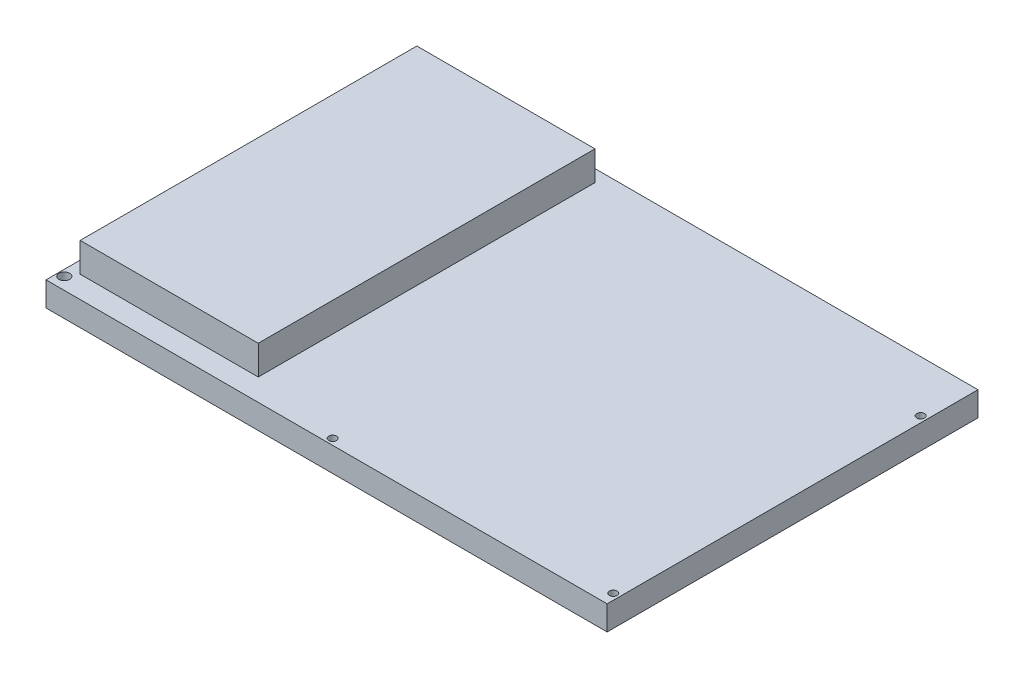
ISO-10303-21;
HEADER;
FILE_DESCRIPTION(('STEP AP214'),'2;1');
FILE_NAME('part.step','',(''),(''),'','','');
FILE_SCHEMA(('AUTOMOTIVE_DESIGN { 1 0 10303 214 1 1 1 1 }'));
ENDSEC;
DATA;
#1=APPLICATION_CONTEXT('core data for automotive mechanical design processes');
#2=APPLICATION_PROTOCOL_DEFINITION('international standard','automotive_design',2000,#1);
#3=PRODUCT_CONTEXT('',#1,'mechanical');
#4=PRODUCT('Part','Part','',(#3));
#5=PRODUCT_RELATED_PRODUCT_CATEGORY('part','',(#4));
#6=PRODUCT_DEFINITION_FORMATION('','',#4);
#7=PRODUCT_DEFINITION_CONTEXT('part definition',#1,'design');
#8=PRODUCT_DEFINITION('design','',#6,#7);
#9=PRODUCT_DEFINITION_SHAPE('','',#8);
#10=(LENGTH_UNIT() NAMED_UNIT(*) SI_UNIT(.MILLI.,.METRE.));
#11=(NAMED_UNIT(*) PLANE_ANGLE_UNIT() SI_UNIT($,.RADIAN.));
#12=(NAMED_UNIT(*) SI_UNIT($,.STERADIAN.) SOLID_ANGLE_UNIT());
#13=UNCERTAINTY_MEASURE_WITH_UNIT(LENGTH_MEASURE(1.E-05),#10,'distance_accuracy_value','');
#14=(GEOMETRIC_REPRESENTATION_CONTEXT(3) GLOBAL_UNCERTAINTY_ASSIGNED_CONTEXT((#13)) GLOBAL_UNIT_ASSIGNED_CONTEXT((#10,
#11,#12)) REPRESENTATION_CONTEXT('',''));
#15=CARTESIAN_POINT('',(0.,0.,0.));
#16=DIRECTION('',(0.,0.,1.));
#17=DIRECTION('',(1.,0.,0.));
#18=AXIS2_PLACEMENT_3D('',#15,#16,#17);
#19=CARTESIAN_POINT('',(0.,10.,0.));
#20=DIRECTION('',(0.,1.,0.));
#21=DIRECTION('',(0.,0.,1.));
#22=AXIS2_PLACEMENT_3D('',#19,#20,#21);
#23=PLANE('',#22);
#24=CARTESIAN_POINT('',(-112.500000000001,10.,70.9999999999998));
#25=DIRECTION('',(0.,1.,0.));
#26=DIRECTION('',(0.,0.,1.));
#27=AXIS2_PLACEMENT_3D('',#24,#25,#26);
#28=CIRCLE('',#27,2.20160884236264);
#29=CARTESIAN_POINT('',(-112.500000000001,10.,73.2016088423624));
#30=VERTEX_POINT('',#29);
#31=EDGE_CURVE('E318',#30,#30,#28,.T.);
#32=ORIENTED_EDGE('',*,*,#31,.F.);
#33=EDGE_LOOP('',(#32));
#34=FACE_BOUND('',#33,.T.);
#35=CARTESIAN_POINT('',(-112.5,10.,-51.0000000000002));
#36=DIRECTION('',(0.,1.,0.));
#37=DIRECTION('',(0.,0.,1.));
#38=AXIS2_PLACEMENT_3D('',#35,#36,#37);
#39=CIRCLE('',#38,1.59999999999999);
#40=CARTESIAN_POINT('',(-112.5,10.,-49.4000000000002));
#41=VERTEX_POINT('',#40);
#42=EDGE_CURVE('E348',#41,#41,#39,.T.);
#43=ORIENTED_EDGE('',*,*,#42,.F.);
#44=EDGE_LOOP('',(#43));
#45=FACE_BOUND('',#44,.T.);
#46=CARTESIAN_POINT('',(112.499999999999,10.,71.0000000000029));
#47=DIRECTION('',(0.,1.,0.));
#48=DIRECTION('',(0.,0.,1.));
#49=AXIS2_PLACEMENT_3D('',#46,#47,#48);
#50=CIRCLE('',#49,1.60000000000001);
#51=CARTESIAN_POINT('',(112.499999999999,10.,72.6000000000029));
#52=VERTEX_POINT('',#51);
#53=EDGE_CURVE('E344',#52,#52,#50,.T.);
#54=ORIENTED_EDGE('',*,*,#53,.F.);
#55=EDGE_LOOP('',(#54));
#56=FACE_BOUND('',#55,.T.);
#57=CARTESIAN_POINT('',(112.5,10.,-54.9999999999971));
#58=DIRECTION('',(0.,1.,0.));
#59=DIRECTION('',(0.,0.,1.));
#60=AXIS2_PLACEMENT_3D('',#57,#58,#59);
#61=CIRCLE('',#60,1.60000000000001);
#62=CARTESIAN_POINT('',(112.5,10.,-53.3999999999971));
#63=VERTEX_POINT('',#62);
#64=EDGE_CURVE('E340',#63,#63,#61,.T.);
#65=ORIENTED_EDGE('',*,*,#64,.F.);
#66=EDGE_LOOP('',(#65));
#67=FACE_BOUND('',#66,.T.);
#68=CARTESIAN_POINT('',(-1.42941214420489E-12,10.,73.5000000000014));
#69=DIRECTION('',(0.,1.,0.));
#70=DIRECTION('',(0.,0.,1.));
#71=AXIS2_PLACEMENT_3D('',#68,#69,#70);
#72=CIRCLE('',#71,1.6);
#73=CARTESIAN_POINT('',(-1.42941214420489E-12,10.,75.1000000000014));
#74=VERTEX_POINT('',#73);
#75=EDGE_CURVE('E335',#74,#74,#72,.T.);
#76=ORIENTED_EDGE('',*,*,#75,.F.);
#77=EDGE_LOOP('',(#76));
#78=FACE_BOUND('',#77,.T.);
#79=DIRECTION('',(0.,0.,-1.));
#80=VECTOR('',#79,1.);
#81=CARTESIAN_POINT('',(-115.,10.,0.));
#82=LINE('',#81,#80);
#83=CARTESIAN_POINT('',(-115.,10.,76.));
#84=VERTEX_POINT('',#83);
#85=CARTESIAN_POINT('',(-115.,10.,-76.));
#86=VERTEX_POINT('',#85);
#87=EDGE_CURVE('E154',#84,#86,#82,.T.);
#88=ORIENTED_EDGE('',*,*,#87,.F.);
#89=DIRECTION('',(-1.,0.,0.));
#90=VECTOR('',#89,1.);
#91=CARTESIAN_POINT('',(0.,10.,76.));
#92=LINE('',#91,#90);
#93=CARTESIAN_POINT('',(115.,10.,76.));
#94=VERTEX_POINT('',#93);
#95=EDGE_CURVE('E157',#94,#84,#92,.T.);
#96=ORIENTED_EDGE('',*,*,#95,.F.);
#97=DIRECTION('',(0.,0.,-1.));
#98=VECTOR('',#97,1.);
#99=CARTESIAN_POINT('',(115.,10.,0.));
#100=LINE('',#99,#98);
#101=CARTESIAN_POINT('',(115.,10.,-76.));
#102=VERTEX_POINT('',#101);
#103=EDGE_CURVE('E162',#94,#102,#100,.T.);
#104=ORIENTED_EDGE('',*,*,#103,.T.);
#105=DIRECTION('',(-1.,0.,0.));
#106=VECTOR('',#105,1.);
#107=CARTESIAN_POINT('',(0.,10.,-76.));
#108=LINE('',#107,#106);
#109=EDGE_CURVE('E70',#102,#86,#108,.T.);
#110=ORIENTED_EDGE('',*,*,#109,.T.);
#111=EDGE_LOOP('',(#88,#96,#104,#110));
#112=FACE_BOUND('',#111,.T.);
#113=DIRECTION('',(1.,0.,0.));
#114=VECTOR('',#113,1.);
#115=CARTESIAN_POINT('',(-110.,10.,67.));
#116=LINE('',#115,#114);
#117=CARTESIAN_POINT('',(-110.,10.,67.));
#118=VERTEX_POINT('',#117);
#119=CARTESIAN_POINT('',(-37.,10.,67.));
#120=VERTEX_POINT('',#119);
#121=EDGE_CURVE('E361',#118,#120,#116,.T.);
#122=ORIENTED_EDGE('',*,*,#121,.F.);
#123=DIRECTION('',(0.,0.,1.));
#124=VECTOR('',#123,1.);
#125=CARTESIAN_POINT('',(-110.,10.,-71.));
#126=LINE('',#125,#124);
#127=CARTESIAN_POINT('',(-110.,10.,-71.));
#128=VERTEX_POINT('',#127);
#129=EDGE_CURVE('E141',#128,#118,#126,.T.);
#130=ORIENTED_EDGE('',*,*,#129,.F.);
#131=DIRECTION('',(-1.,0.,0.));
#132=VECTOR('',#131,1.);
#133=CARTESIAN_POINT('',(-110.,10.,-71.));
#134=LINE('',#133,#132);
#135=CARTESIAN_POINT('',(-37.,10.,-71.));
#136=VERTEX_POINT('',#135);
#137=EDGE_CURVE('E137',#136,#128,#134,.T.);
#138=ORIENTED_EDGE('',*,*,#137,.F.);
#139=DIRECTION('',(0.,0.,-1.));
#140=VECTOR('',#139,1.);
#141=CARTESIAN_POINT('',(-37.,10.,-71.));
#142=LINE('',#141,#140);
#143=EDGE_CURVE('E364',#120,#136,#142,.T.);
#144=ORIENTED_EDGE('',*,*,#143,.F.);
#145=EDGE_LOOP('',(#122,#130,#138,#144));
#146=FACE_BOUND('',#145,.T.);
#147=ADVANCED_FACE('F45',(#34,#45,#56,#67,#78,#112,#146),#23,.T.);
#148=CARTESIAN_POINT('',(-115.,10.,0.));
#149=DIRECTION('',(-1.,0.,0.));
#150=DIRECTION('',(0.,0.,1.));
#151=AXIS2_PLACEMENT_3D('',#148,#149,#150);
#152=PLANE('',#151);
#153=DIRECTION('',(0.,0.,-1.));
#154=VECTOR('',#153,1.);
#155=CARTESIAN_POINT('',(-115.,0.,0.));
#156=LINE('',#155,#154);
#157=CARTESIAN_POINT('',(-115.,0.,76.));
#158=VERTEX_POINT('',#157);
#159=CARTESIAN_POINT('',(-115.,0.,-76.));
#160=VERTEX_POINT('',#159);
#161=EDGE_CURVE('E144',#158,#160,#156,.T.);
#162=ORIENTED_EDGE('',*,*,#161,.F.);
#163=DIRECTION('',(0.,-1.,0.));
#164=VECTOR('',#163,1.);
#165=CARTESIAN_POINT('',(-115.,10.,76.));
#166=LINE('',#165,#164);
#167=EDGE_CURVE('E11',#84,#158,#166,.T.);
#168=ORIENTED_EDGE('',*,*,#167,.F.);
#169=ORIENTED_EDGE('',*,*,#87,.T.);
#170=DIRECTION('',(0.,-1.,0.));
#171=VECTOR('',#170,1.);
#172=CARTESIAN_POINT('',(-115.,10.,-76.));
#173=LINE('',#172,#171);
#174=EDGE_CURVE('E90',#86,#160,#173,.T.);
#175=ORIENTED_EDGE('',*,*,#174,.T.);
#176=EDGE_LOOP('',(#162,#168,#169,#175));
#177=FACE_BOUND('',#176,.T.);
#178=ADVANCED_FACE('F47',(#177),#152,.T.);
#179=CARTESIAN_POINT('',(0.,10.,76.));
#180=DIRECTION('',(0.,0.,1.));
#181=DIRECTION('',(1.,0.,0.));
#182=AXIS2_PLACEMENT_3D('',#179,#180,#181);
#183=PLANE('',#182);
#184=DIRECTION('',(-1.,0.,0.));
#185=VECTOR('',#184,1.);
#186=CARTESIAN_POINT('',(0.,0.,76.));
#187=LINE('',#186,#185);
#188=CARTESIAN_POINT('',(115.,0.,76.));
#189=VERTEX_POINT('',#188);
#190=EDGE_CURVE('E149',#189,#158,#187,.T.);
#191=ORIENTED_EDGE('',*,*,#190,.F.);
#192=DIRECTION('',(0.,-1.,0.));
#193=VECTOR('',#192,1.);
#194=CARTESIAN_POINT('',(115.,10.,76.));
#195=LINE('',#194,#193);
#196=EDGE_CURVE('E54',#94,#189,#195,.T.);
#197=ORIENTED_EDGE('',*,*,#196,.F.);
#198=ORIENTED_EDGE('',*,*,#95,.T.);
#199=ORIENTED_EDGE('',*,*,#167,.T.);
#200=EDGE_LOOP('',(#191,#197,#198,#199));
#201=FACE_BOUND('',#200,.T.);
#202=ADVANCED_FACE('F192',(#201),#183,.T.);
#203=CARTESIAN_POINT('',(115.,10.,0.));
#204=DIRECTION('',(-1.,0.,0.));
#205=DIRECTION('',(0.,0.,1.));
#206=AXIS2_PLACEMENT_3D('',#203,#204,#205);
#207=PLANE('',#206);
#208=DIRECTION('',(0.,0.,-1.));
#209=VECTOR('',#208,1.);
#210=CARTESIAN_POINT('',(115.,0.,0.));
#211=LINE('',#210,#209);
#212=CARTESIAN_POINT('',(115.,0.,-76.));
#213=VERTEX_POINT('',#212);
#214=EDGE_CURVE('E170',#189,#213,#211,.T.);
#215=ORIENTED_EDGE('',*,*,#214,.T.);
#216=DIRECTION('',(0.,-1.,0.));
#217=VECTOR('',#216,1.);
#218=CARTESIAN_POINT('',(115.,10.,-76.));
#219=LINE('',#218,#217);
#220=EDGE_CURVE('E177',#102,#213,#219,.T.);
#221=ORIENTED_EDGE('',*,*,#220,.F.);
#222=ORIENTED_EDGE('',*,*,#103,.F.);
#223=ORIENTED_EDGE('',*,*,#196,.T.);
#224=EDGE_LOOP('',(#215,#221,#222,#223));
#225=FACE_BOUND('',#224,.T.);
#226=ADVANCED_FACE('F184',(#225),#207,.F.);
#227=CARTESIAN_POINT('',(0.,10.,-76.));
#228=DIRECTION('',(0.,0.,1.));
#229=DIRECTION('',(1.,0.,0.));
#230=AXIS2_PLACEMENT_3D('',#227,#228,#229);
#231=PLANE('',#230);
#232=DIRECTION('',(-1.,0.,0.));
#233=VECTOR('',#232,1.);
#234=CARTESIAN_POINT('',(0.,0.,-76.));
#235=LINE('',#234,#233);
#236=EDGE_CURVE('E158',#213,#160,#235,.T.);
#237=ORIENTED_EDGE('',*,*,#236,.T.);
#238=ORIENTED_EDGE('',*,*,#174,.F.);
#239=ORIENTED_EDGE('',*,*,#109,.F.);
#240=ORIENTED_EDGE('',*,*,#220,.T.);
#241=EDGE_LOOP('',(#237,#238,#239,#240));
#242=FACE_BOUND('',#241,.T.);
#243=ADVANCED_FACE('F210',(#242),#231,.F.);
#244=CARTESIAN_POINT('',(0.,0.,0.));
#245=DIRECTION('',(0.,1.,0.));
#246=DIRECTION('',(0.,0.,1.));
#247=AXIS2_PLACEMENT_3D('',#244,#245,#246);
#248=PLANE('',#247);
#249=CARTESIAN_POINT('',(-112.500000000001,0.,70.9999999999998));
#250=DIRECTION('',(0.,-1.,0.));
#251=DIRECTION('',(0.,0.,-1.));
#252=AXIS2_PLACEMENT_3D('',#249,#250,#251);
#253=CIRCLE('',#252,2.20160884236264);
#254=CARTESIAN_POINT('',(-112.500000000001,0.,68.7983911576371));
#255=VERTEX_POINT('',#254);
#256=EDGE_CURVE('E321',#255,#255,#253,.T.);
#257=ORIENTED_EDGE('',*,*,#256,.F.);
#258=EDGE_LOOP('',(#257));
#259=FACE_BOUND('',#258,.T.);
#260=CARTESIAN_POINT('',(-112.5,0.,-51.0000000000002));
#261=DIRECTION('',(0.,-1.,0.));
#262=DIRECTION('',(0.,0.,-1.));
#263=AXIS2_PLACEMENT_3D('',#260,#261,#262);
#264=CIRCLE('',#263,1.59999999999999);
#265=CARTESIAN_POINT('',(-112.5,0.,-52.6000000000002));
#266=VERTEX_POINT('',#265);
#267=EDGE_CURVE('E323',#266,#266,#264,.T.);
#268=ORIENTED_EDGE('',*,*,#267,.F.);
#269=EDGE_LOOP('',(#268));
#270=FACE_BOUND('',#269,.T.);
#271=CARTESIAN_POINT('',(112.499999999999,0.,71.0000000000029));
#272=DIRECTION('',(0.,-1.,0.));
#273=DIRECTION('',(0.,0.,-1.));
#274=AXIS2_PLACEMENT_3D('',#271,#272,#273);
#275=CIRCLE('',#274,1.60000000000001);
#276=CARTESIAN_POINT('',(112.499999999999,0.,69.4000000000029));
#277=VERTEX_POINT('',#276);
#278=EDGE_CURVE('E327',#277,#277,#275,.T.);
#279=ORIENTED_EDGE('',*,*,#278,.F.);
#280=EDGE_LOOP('',(#279));
#281=FACE_BOUND('',#280,.T.);
#282=CARTESIAN_POINT('',(112.5,0.,-54.9999999999971));
#283=DIRECTION('',(0.,-1.,0.));
#284=DIRECTION('',(0.,0.,-1.));
#285=AXIS2_PLACEMENT_3D('',#282,#283,#284);
#286=CIRCLE('',#285,1.60000000000001);
#287=CARTESIAN_POINT('',(112.5,0.,-56.5999999999971));
#288=VERTEX_POINT('',#287);
#289=EDGE_CURVE('E336',#288,#288,#286,.T.);
#290=ORIENTED_EDGE('',*,*,#289,.F.);
#291=EDGE_LOOP('',(#290));
#292=FACE_BOUND('',#291,.T.);
#293=CARTESIAN_POINT('',(-1.42941214420489E-12,0.,73.5000000000014));
#294=DIRECTION('',(0.,-1.,0.));
#295=DIRECTION('',(0.,0.,-1.));
#296=AXIS2_PLACEMENT_3D('',#293,#294,#295);
#297=CIRCLE('',#296,1.6);
#298=CARTESIAN_POINT('',(-1.42941214420489E-12,0.,71.9000000000014));
#299=VERTEX_POINT('',#298);
#300=EDGE_CURVE('E331',#299,#299,#297,.T.);
#301=ORIENTED_EDGE('',*,*,#300,.F.);
#302=EDGE_LOOP('',(#301));
#303=FACE_BOUND('',#302,.T.);
#304=ORIENTED_EDGE('',*,*,#161,.T.);
#305=ORIENTED_EDGE('',*,*,#236,.F.);
#306=ORIENTED_EDGE('',*,*,#214,.F.);
#307=ORIENTED_EDGE('',*,*,#190,.T.);
#308=EDGE_LOOP('',(#304,#305,#306,#307));
#309=FACE_BOUND('',#308,.T.);
#310=ADVANCED_FACE('F191',(#259,#270,#281,#292,#303,#309),#248,.F.);
#311=CARTESIAN_POINT('',(-110.,22.,-71.));
#312=DIRECTION('',(1.,0.,0.));
#313=DIRECTION('',(0.,0.,-1.));
#314=AXIS2_PLACEMENT_3D('',#311,#312,#313);
#315=PLANE('',#314);
#316=ORIENTED_EDGE('',*,*,#129,.T.);
#317=DIRECTION('',(0.,-1.,0.));
#318=VECTOR('',#317,1.);
#319=CARTESIAN_POINT('',(-110.,22.,67.));
#320=LINE('',#319,#318);
#321=CARTESIAN_POINT('',(-110.,22.,67.));
#322=VERTEX_POINT('',#321);
#323=EDGE_CURVE('E120',#322,#118,#320,.T.);
#324=ORIENTED_EDGE('',*,*,#323,.F.);
#325=DIRECTION('',(0.,0.,1.));
#326=VECTOR('',#325,1.);
#327=CARTESIAN_POINT('',(-110.,22.,-71.));
#328=LINE('',#327,#326);
#329=CARTESIAN_POINT('',(-110.,22.,-71.));
#330=VERTEX_POINT('',#329);
#331=EDGE_CURVE('E128',#330,#322,#328,.T.);
#332=ORIENTED_EDGE('',*,*,#331,.F.);
#333=DIRECTION('',(0.,-1.,0.));
#334=VECTOR('',#333,1.);
#335=CARTESIAN_POINT('',(-110.,22.,-71.));
#336=LINE('',#335,#334);
#337=EDGE_CURVE('E358',#330,#128,#336,.T.);
#338=ORIENTED_EDGE('',*,*,#337,.T.);
#339=EDGE_LOOP('',(#316,#324,#332,#338));
#340=FACE_BOUND('',#339,.T.);
#341=ADVANCED_FACE('F139',(#340),#315,.F.);
#342=CARTESIAN_POINT('',(-110.,22.,67.));
#343=DIRECTION('',(0.,0.,-1.));
#344=DIRECTION('',(-1.,0.,0.));
#345=AXIS2_PLACEMENT_3D('',#342,#343,#344);
#346=PLANE('',#345);
#347=ORIENTED_EDGE('',*,*,#121,.T.);
#348=DIRECTION('',(0.,-1.,0.));
#349=VECTOR('',#348,1.);
#350=CARTESIAN_POINT('',(-37.,22.,67.));
#351=LINE('',#350,#349);
#352=CARTESIAN_POINT('',(-37.,22.,67.));
#353=VERTEX_POINT('',#352);
#354=EDGE_CURVE('E123',#353,#120,#351,.T.);
#355=ORIENTED_EDGE('',*,*,#354,.F.);
#356=DIRECTION('',(1.,0.,0.));
#357=VECTOR('',#356,1.);
#358=CARTESIAN_POINT('',(-110.,22.,67.));
#359=LINE('',#358,#357);
#360=EDGE_CURVE('E116',#322,#353,#359,.T.);
#361=ORIENTED_EDGE('',*,*,#360,.F.);
#362=ORIENTED_EDGE('',*,*,#323,.T.);
#363=EDGE_LOOP('',(#347,#355,#361,#362));
#364=FACE_BOUND('',#363,.T.);
#365=ADVANCED_FACE('F118',(#364),#346,.F.);
#366=CARTESIAN_POINT('',(-37.,22.,-71.));
#367=DIRECTION('',(-1.,0.,0.));
#368=DIRECTION('',(0.,0.,1.));
#369=AXIS2_PLACEMENT_3D('',#366,#367,#368);
#370=PLANE('',#369);
#371=ORIENTED_EDGE('',*,*,#143,.T.);
#372=DIRECTION('',(0.,-1.,0.));
#373=VECTOR('',#372,1.);
#374=CARTESIAN_POINT('',(-37.,22.,-71.));
#375=LINE('',#374,#373);
#376=CARTESIAN_POINT('',(-37.,22.,-71.));
#377=VERTEX_POINT('',#376);
#378=EDGE_CURVE('E61',#377,#136,#375,.T.);
#379=ORIENTED_EDGE('',*,*,#378,.F.);
#380=DIRECTION('',(0.,0.,-1.));
#381=VECTOR('',#380,1.);
#382=CARTESIAN_POINT('',(-37.,22.,-71.));
#383=LINE('',#382,#381);
#384=EDGE_CURVE('E127',#353,#377,#383,.T.);
#385=ORIENTED_EDGE('',*,*,#384,.F.);
#386=ORIENTED_EDGE('',*,*,#354,.T.);
#387=EDGE_LOOP('',(#371,#379,#385,#386));
#388=FACE_BOUND('',#387,.T.);
#389=ADVANCED_FACE('F240',(#388),#370,.F.);
#390=CARTESIAN_POINT('',(-110.,22.,-71.));
#391=DIRECTION('',(0.,0.,1.));
#392=DIRECTION('',(1.,0.,0.));
#393=AXIS2_PLACEMENT_3D('',#390,#391,#392);
#394=PLANE('',#393);
#395=ORIENTED_EDGE('',*,*,#137,.T.);
#396=ORIENTED_EDGE('',*,*,#337,.F.);
#397=DIRECTION('',(-1.,0.,0.));
#398=VECTOR('',#397,1.);
#399=CARTESIAN_POINT('',(-110.,22.,-71.));
#400=LINE('',#399,#398);
#401=EDGE_CURVE('E132',#377,#330,#400,.T.);
#402=ORIENTED_EDGE('',*,*,#401,.F.);
#403=ORIENTED_EDGE('',*,*,#378,.T.);
#404=EDGE_LOOP('',(#395,#396,#402,#403));
#405=FACE_BOUND('',#404,.T.);
#406=ADVANCED_FACE('F247',(#405),#394,.F.);
#407=CARTESIAN_POINT('',(0.,22.,0.));
#408=DIRECTION('',(0.,1.,0.));
#409=DIRECTION('',(0.,0.,1.));
#410=AXIS2_PLACEMENT_3D('',#407,#408,#409);
#411=PLANE('',#410);
#412=ORIENTED_EDGE('',*,*,#331,.T.);
#413=ORIENTED_EDGE('',*,*,#360,.T.);
#414=ORIENTED_EDGE('',*,*,#384,.T.);
#415=ORIENTED_EDGE('',*,*,#401,.T.);
#416=EDGE_LOOP('',(#412,#413,#414,#415));
#417=FACE_BOUND('',#416,.T.);
#418=ADVANCED_FACE('F131',(#417),#411,.T.);
#419=CARTESIAN_POINT('',(-1.42941214420489E-12,22.,73.5000000000014));
#420=DIRECTION('',(0.,-1.,0.));
#421=DIRECTION('',(0.,0.,-1.));
#422=AXIS2_PLACEMENT_3D('',#419,#420,#421);
#423=CYLINDRICAL_SURFACE('',#422,1.6);
#424=ORIENTED_EDGE('',*,*,#75,.T.);
#425=EDGE_LOOP('',(#424));
#426=FACE_BOUND('',#425,.T.);
#427=ORIENTED_EDGE('',*,*,#300,.T.);
#428=EDGE_LOOP('',(#427));
#429=FACE_BOUND('',#428,.T.);
#430=ADVANCED_FACE('F261',(#426,#429),#423,.F.);
#431=CARTESIAN_POINT('',(112.5,22.,-54.9999999999971));
#432=DIRECTION('',(0.,-1.,0.));
#433=DIRECTION('',(0.,0.,-1.));
#434=AXIS2_PLACEMENT_3D('',#431,#432,#433);
#435=CYLINDRICAL_SURFACE('',#434,1.60000000000001);
#436=ORIENTED_EDGE('',*,*,#64,.T.);
#437=EDGE_LOOP('',(#436));
#438=FACE_BOUND('',#437,.T.);
#439=ORIENTED_EDGE('',*,*,#289,.T.);
#440=EDGE_LOOP('',(#439));
#441=FACE_BOUND('',#440,.T.);
#442=ADVANCED_FACE('F273',(#438,#441),#435,.F.);
#443=CARTESIAN_POINT('',(112.499999999999,22.,71.0000000000029));
#444=DIRECTION('',(0.,-1.,0.));
#445=DIRECTION('',(0.,0.,-1.));
#446=AXIS2_PLACEMENT_3D('',#443,#444,#445);
#447=CYLINDRICAL_SURFACE('',#446,1.60000000000001);
#448=ORIENTED_EDGE('',*,*,#53,.T.);
#449=EDGE_LOOP('',(#448));
#450=FACE_BOUND('',#449,.T.);
#451=ORIENTED_EDGE('',*,*,#278,.T.);
#452=EDGE_LOOP('',(#451));
#453=FACE_BOUND('',#452,.T.);
#454=ADVANCED_FACE('F283',(#450,#453),#447,.F.);
#455=CARTESIAN_POINT('',(-112.5,22.,-51.0000000000002));
#456=DIRECTION('',(0.,-1.,0.));
#457=DIRECTION('',(0.,0.,-1.));
#458=AXIS2_PLACEMENT_3D('',#455,#456,#457);
#459=CYLINDRICAL_SURFACE('',#458,1.59999999999999);
#460=ORIENTED_EDGE('',*,*,#42,.T.);
#461=EDGE_LOOP('',(#460));
#462=FACE_BOUND('',#461,.T.);
#463=ORIENTED_EDGE('',*,*,#267,.T.);
#464=EDGE_LOOP('',(#463));
#465=FACE_BOUND('',#464,.T.);
#466=ADVANCED_FACE('F293',(#462,#465),#459,.F.);
#467=CARTESIAN_POINT('',(-112.500000000001,22.,70.9999999999998));
#468=DIRECTION('',(0.,-1.,0.));
#469=DIRECTION('',(0.,0.,-1.));
#470=AXIS2_PLACEMENT_3D('',#467,#468,#469);
#471=CYLINDRICAL_SURFACE('',#470,2.20160884236264);
#472=ORIENTED_EDGE('',*,*,#31,.T.);
#473=EDGE_LOOP('',(#472));
#474=FACE_BOUND('',#473,.T.);
#475=ORIENTED_EDGE('',*,*,#256,.T.);
#476=EDGE_LOOP('',(#475));
#477=FACE_BOUND('',#476,.T.);
#478=ADVANCED_FACE('F303',(#474,#477),#471,.F.);
#479=CLOSED_SHELL('',(#147,#178,#202,#226,#243,#310,#341,#365,#389,#406,#418,#430,#442,#454,
#466,#478));
#480=MANIFOLD_SOLID_BREP('B2',#479);
#481=ADVANCED_BREP_SHAPE_REPRESENTATION('',(#18,#480),#14);
#482=SHAPE_DEFINITION_REPRESENTATION(#9,#481);
ENDSEC;
END-ISO-10303-21;
